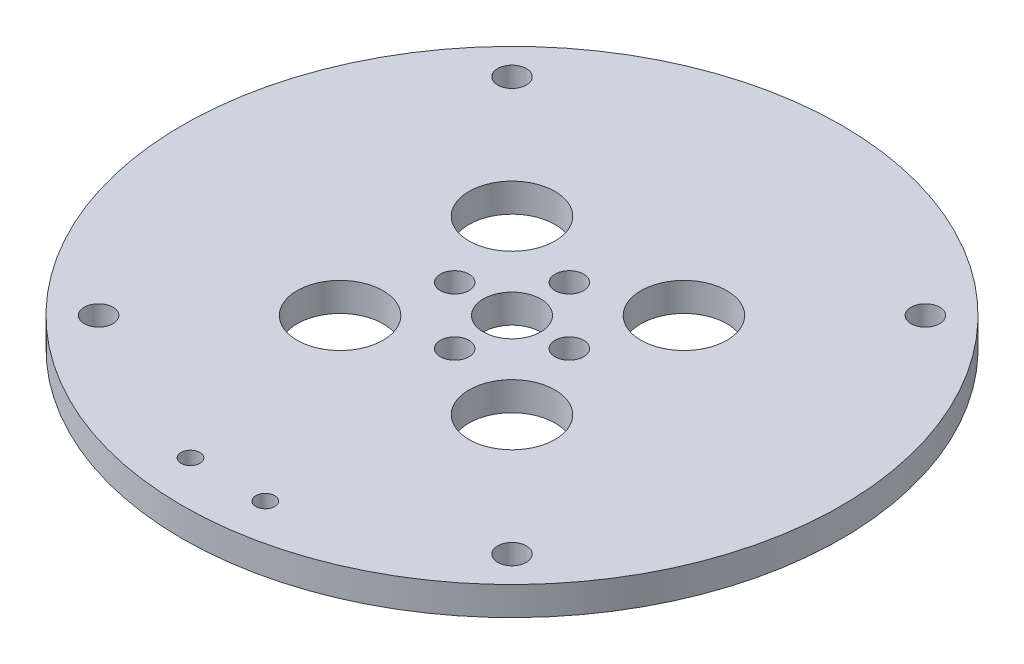
ISO-10303-21;
HEADER;
FILE_DESCRIPTION(('STEP AP214'),'2;1');
FILE_NAME('part.step','',(''),(''),'','','');
FILE_SCHEMA(('AUTOMOTIVE_DESIGN { 1 0 10303 214 1 1 1 1 }'));
ENDSEC;
DATA;
#1=APPLICATION_CONTEXT('core data for automotive mechanical design processes');
#2=APPLICATION_PROTOCOL_DEFINITION('international standard','automotive_design',2000,#1);
#3=PRODUCT_CONTEXT('',#1,'mechanical');
#4=PRODUCT('Part','Part','',(#3));
#5=PRODUCT_RELATED_PRODUCT_CATEGORY('part','',(#4));
#6=PRODUCT_DEFINITION_FORMATION('','',#4);
#7=PRODUCT_DEFINITION_CONTEXT('part definition',#1,'design');
#8=PRODUCT_DEFINITION('design','',#6,#7);
#9=PRODUCT_DEFINITION_SHAPE('','',#8);
#10=(LENGTH_UNIT() NAMED_UNIT(*) SI_UNIT(.MILLI.,.METRE.));
#11=(NAMED_UNIT(*) PLANE_ANGLE_UNIT() SI_UNIT($,.RADIAN.));
#12=(NAMED_UNIT(*) SI_UNIT($,.STERADIAN.) SOLID_ANGLE_UNIT());
#13=UNCERTAINTY_MEASURE_WITH_UNIT(LENGTH_MEASURE(1.E-05),#10,'distance_accuracy_value','');
#14=(GEOMETRIC_REPRESENTATION_CONTEXT(3) GLOBAL_UNCERTAINTY_ASSIGNED_CONTEXT((#13)) GLOBAL_UNIT_ASSIGNED_CONTEXT((#10,
#11,#12)) REPRESENTATION_CONTEXT('',''));
#15=CARTESIAN_POINT('',(0.,0.,0.));
#16=DIRECTION('',(0.,0.,1.));
#17=DIRECTION('',(1.,0.,0.));
#18=AXIS2_PLACEMENT_3D('',#15,#16,#17);
#19=CARTESIAN_POINT('',(0.,5.,0.));
#20=DIRECTION('',(0.,1.,0.));
#21=DIRECTION('',(0.,0.,1.));
#22=AXIS2_PLACEMENT_3D('',#19,#20,#21);
#23=PLANE('',#22);
#24=CARTESIAN_POINT('',(36.062445840514,5.,36.0624458405139));
#25=DIRECTION('',(0.,1.,0.));
#26=DIRECTION('',(0.,0.,1.));
#27=AXIS2_PLACEMENT_3D('',#24,#25,#26);
#28=CIRCLE('',#27,2.50000000000035);
#29=CARTESIAN_POINT('',(36.062445840514,5.,38.5624458405143));
#30=VERTEX_POINT('',#29);
#31=EDGE_CURVE('E119',#30,#30,#28,.T.);
#32=ORIENTED_EDGE('',*,*,#31,.F.);
#33=EDGE_LOOP('',(#32));
#34=FACE_BOUND('',#33,.T.);
#35=CARTESIAN_POINT('',(6.52630961100226,5.,49.5722430686906));
#36=DIRECTION('',(0.,1.,0.));
#37=DIRECTION('',(0.,0.,-1.));
#38=AXIS2_PLACEMENT_3D('',#35,#36,#37);
#39=CIRCLE('',#38,1.65);
#40=CARTESIAN_POINT('',(6.52630961100226,5.,47.9222430686906));
#41=VERTEX_POINT('',#40);
#42=EDGE_CURVE('E107',#41,#41,#39,.T.);
#43=ORIENTED_EDGE('',*,*,#42,.F.);
#44=EDGE_LOOP('',(#43));
#45=FACE_BOUND('',#44,.T.);
#46=CARTESIAN_POINT('',(-15.,5.,-15.));
#47=DIRECTION('',(0.,1.,0.));
#48=DIRECTION('',(0.,0.,-1.));
#49=AXIS2_PLACEMENT_3D('',#46,#47,#48);
#50=CIRCLE('',#49,7.5);
#51=CARTESIAN_POINT('',(-15.,5.,-22.5));
#52=VERTEX_POINT('',#51);
#53=EDGE_CURVE('E95',#52,#52,#50,.T.);
#54=ORIENTED_EDGE('',*,*,#53,.F.);
#55=EDGE_LOOP('',(#54));
#56=FACE_BOUND('',#55,.T.);
#57=CARTESIAN_POINT('',(15.,5.,15.));
#58=DIRECTION('',(0.,1.,0.));
#59=DIRECTION('',(0.,0.,-1.));
#60=AXIS2_PLACEMENT_3D('',#57,#58,#59);
#61=CIRCLE('',#60,7.5);
#62=CARTESIAN_POINT('',(15.,5.,7.5));
#63=VERTEX_POINT('',#62);
#64=EDGE_CURVE('E83',#63,#63,#61,.T.);
#65=ORIENTED_EDGE('',*,*,#64,.F.);
#66=EDGE_LOOP('',(#65));
#67=FACE_BOUND('',#66,.T.);
#68=CARTESIAN_POINT('',(0.,5.,-10.));
#69=DIRECTION('',(0.,1.,0.));
#70=DIRECTION('',(0.,0.,1.));
#71=AXIS2_PLACEMENT_3D('',#68,#69,#70);
#72=CIRCLE('',#71,2.5);
#73=CARTESIAN_POINT('',(0.,5.,-7.5));
#74=VERTEX_POINT('',#73);
#75=EDGE_CURVE('E71',#74,#74,#72,.T.);
#76=ORIENTED_EDGE('',*,*,#75,.F.);
#77=EDGE_LOOP('',(#76));
#78=FACE_BOUND('',#77,.T.);
#79=CARTESIAN_POINT('',(-10.,5.,0.));
#80=DIRECTION('',(0.,1.,0.));
#81=DIRECTION('',(0.,0.,1.));
#82=AXIS2_PLACEMENT_3D('',#79,#80,#81);
#83=CIRCLE('',#82,2.5);
#84=CARTESIAN_POINT('',(-10.,5.,2.5));
#85=VERTEX_POINT('',#84);
#86=EDGE_CURVE('E59',#85,#85,#83,.T.);
#87=ORIENTED_EDGE('',*,*,#86,.F.);
#88=EDGE_LOOP('',(#87));
#89=FACE_BOUND('',#88,.T.);
#90=CARTESIAN_POINT('',(10.,5.,0.));
#91=DIRECTION('',(0.,1.,0.));
#92=DIRECTION('',(0.,0.,1.));
#93=AXIS2_PLACEMENT_3D('',#90,#91,#92);
#94=CIRCLE('',#93,2.5);
#95=CARTESIAN_POINT('',(10.,5.,2.5));
#96=VERTEX_POINT('',#95);
#97=EDGE_CURVE('E47',#96,#96,#94,.T.);
#98=ORIENTED_EDGE('',*,*,#97,.F.);
#99=EDGE_LOOP('',(#98));
#100=FACE_BOUND('',#99,.T.);
#101=CARTESIAN_POINT('',(0.,5.,0.));
#102=DIRECTION('',(0.,1.,0.));
#103=DIRECTION('',(0.,0.,1.));
#104=AXIS2_PLACEMENT_3D('',#101,#102,#103);
#105=CIRCLE('',#104,57.5);
#106=CARTESIAN_POINT('',(0.,5.,57.5));
#107=VERTEX_POINT('',#106);
#108=EDGE_CURVE('E10',#107,#107,#105,.T.);
#109=ORIENTED_EDGE('',*,*,#108,.T.);
#110=EDGE_LOOP('',(#109));
#111=FACE_BOUND('',#110,.T.);
#112=CARTESIAN_POINT('',(-36.0624458405139,5.,-36.0624458405139));
#113=DIRECTION('',(0.,1.,0.));
#114=DIRECTION('',(0.,0.,1.));
#115=AXIS2_PLACEMENT_3D('',#112,#113,#114);
#116=CIRCLE('',#115,2.5);
#117=CARTESIAN_POINT('',(-36.0624458405139,5.,-33.5624458405139));
#118=VERTEX_POINT('',#117);
#119=EDGE_CURVE('E42',#118,#118,#116,.T.);
#120=ORIENTED_EDGE('',*,*,#119,.F.);
#121=EDGE_LOOP('',(#120));
#122=FACE_BOUND('',#121,.T.);
#123=CARTESIAN_POINT('',(0.,5.,10.));
#124=DIRECTION('',(0.,1.,0.));
#125=DIRECTION('',(0.,0.,1.));
#126=AXIS2_PLACEMENT_3D('',#123,#124,#125);
#127=CIRCLE('',#126,2.5);
#128=CARTESIAN_POINT('',(0.,5.,12.5));
#129=VERTEX_POINT('',#128);
#130=EDGE_CURVE('E53',#129,#129,#127,.T.);
#131=ORIENTED_EDGE('',*,*,#130,.F.);
#132=EDGE_LOOP('',(#131));
#133=FACE_BOUND('',#132,.T.);
#134=CARTESIAN_POINT('',(0.,5.,0.));
#135=DIRECTION('',(0.,1.,0.));
#136=DIRECTION('',(0.,0.,1.));
#137=AXIS2_PLACEMENT_3D('',#134,#135,#136);
#138=CIRCLE('',#137,5.);
#139=CARTESIAN_POINT('',(0.,5.,5.));
#140=VERTEX_POINT('',#139);
#141=EDGE_CURVE('E65',#140,#140,#138,.T.);
#142=ORIENTED_EDGE('',*,*,#141,.F.);
#143=EDGE_LOOP('',(#142));
#144=FACE_BOUND('',#143,.T.);
#145=CARTESIAN_POINT('',(15.,5.,-15.));
#146=DIRECTION('',(0.,1.,0.));
#147=DIRECTION('',(0.,0.,1.));
#148=AXIS2_PLACEMENT_3D('',#145,#146,#147);
#149=CIRCLE('',#148,7.5);
#150=CARTESIAN_POINT('',(15.,5.,-7.5));
#151=VERTEX_POINT('',#150);
#152=EDGE_CURVE('E77',#151,#151,#149,.T.);
#153=ORIENTED_EDGE('',*,*,#152,.F.);
#154=EDGE_LOOP('',(#153));
#155=FACE_BOUND('',#154,.T.);
#156=CARTESIAN_POINT('',(-15.,5.,15.));
#157=DIRECTION('',(0.,1.,0.));
#158=DIRECTION('',(0.,0.,1.));
#159=AXIS2_PLACEMENT_3D('',#156,#157,#158);
#160=CIRCLE('',#159,7.5);
#161=CARTESIAN_POINT('',(-15.,5.,22.5));
#162=VERTEX_POINT('',#161);
#163=EDGE_CURVE('E89',#162,#162,#160,.T.);
#164=ORIENTED_EDGE('',*,*,#163,.F.);
#165=EDGE_LOOP('',(#164));
#166=FACE_BOUND('',#165,.T.);
#167=CARTESIAN_POINT('',(-6.52630961100223,5.,49.5722430686906));
#168=DIRECTION('',(0.,1.,0.));
#169=DIRECTION('',(0.,0.,1.));
#170=AXIS2_PLACEMENT_3D('',#167,#168,#169);
#171=CIRCLE('',#170,1.65);
#172=CARTESIAN_POINT('',(-6.52630961100223,5.,51.2222430686906));
#173=VERTEX_POINT('',#172);
#174=EDGE_CURVE('E101',#173,#173,#171,.T.);
#175=ORIENTED_EDGE('',*,*,#174,.F.);
#176=EDGE_LOOP('',(#175));
#177=FACE_BOUND('',#176,.T.);
#178=CARTESIAN_POINT('',(36.0624458405139,5.,-36.0624458405139));
#179=DIRECTION('',(0.,1.,0.));
#180=DIRECTION('',(0.,0.,1.));
#181=AXIS2_PLACEMENT_3D('',#178,#179,#180);
#182=CIRCLE('',#181,2.50000000000018);
#183=CARTESIAN_POINT('',(36.0624458405139,5.,-33.5624458405138));
#184=VERTEX_POINT('',#183);
#185=EDGE_CURVE('E113',#184,#184,#182,.T.);
#186=ORIENTED_EDGE('',*,*,#185,.F.);
#187=EDGE_LOOP('',(#186));
#188=FACE_BOUND('',#187,.T.);
#189=CARTESIAN_POINT('',(-36.0624458405139,5.,36.0624458405139));
#190=DIRECTION('',(0.,1.,0.));
#191=DIRECTION('',(0.,0.,1.));
#192=AXIS2_PLACEMENT_3D('',#189,#190,#191);
#193=CIRCLE('',#192,2.50000000000049);
#194=CARTESIAN_POINT('',(-36.0624458405139,5.,38.5624458405144));
#195=VERTEX_POINT('',#194);
#196=EDGE_CURVE('E125',#195,#195,#193,.T.);
#197=ORIENTED_EDGE('',*,*,#196,.F.);
#198=EDGE_LOOP('',(#197));
#199=FACE_BOUND('',#198,.T.);
#200=ADVANCED_FACE('F31',(#34,#45,#56,#67,#78,#89,#100,#111,#122,#133,#144,#155,#166,#177,#188,
#199),#23,.T.);
#201=CARTESIAN_POINT('',(0.,0.,0.));
#202=DIRECTION('',(0.,1.,0.));
#203=DIRECTION('',(0.,0.,1.));
#204=AXIS2_PLACEMENT_3D('',#201,#202,#203);
#205=PLANE('',#204);
#206=CARTESIAN_POINT('',(0.,0.,0.));
#207=DIRECTION('',(0.,1.,0.));
#208=DIRECTION('',(0.,0.,1.));
#209=AXIS2_PLACEMENT_3D('',#206,#207,#208);
#210=CIRCLE('',#209,57.5);
#211=CARTESIAN_POINT('',(0.,0.,57.5));
#212=VERTEX_POINT('',#211);
#213=EDGE_CURVE('E35',#212,#212,#210,.T.);
#214=ORIENTED_EDGE('',*,*,#213,.F.);
#215=EDGE_LOOP('',(#214));
#216=FACE_BOUND('',#215,.T.);
#217=CARTESIAN_POINT('',(-36.0624458405139,0.,-36.0624458405139));
#218=DIRECTION('',(0.,1.,0.));
#219=DIRECTION('',(0.,0.,1.));
#220=AXIS2_PLACEMENT_3D('',#217,#218,#219);
#221=CIRCLE('',#220,2.5);
#222=CARTESIAN_POINT('',(-36.0624458405139,0.,-33.5624458405139));
#223=VERTEX_POINT('',#222);
#224=EDGE_CURVE('E44',#223,#223,#221,.T.);
#225=ORIENTED_EDGE('',*,*,#224,.T.);
#226=EDGE_LOOP('',(#225));
#227=FACE_BOUND('',#226,.T.);
#228=CARTESIAN_POINT('',(10.,0.,0.));
#229=DIRECTION('',(0.,1.,0.));
#230=DIRECTION('',(0.,0.,1.));
#231=AXIS2_PLACEMENT_3D('',#228,#229,#230);
#232=CIRCLE('',#231,2.5);
#233=CARTESIAN_POINT('',(10.,0.,2.5));
#234=VERTEX_POINT('',#233);
#235=EDGE_CURVE('E50',#234,#234,#232,.T.);
#236=ORIENTED_EDGE('',*,*,#235,.T.);
#237=EDGE_LOOP('',(#236));
#238=FACE_BOUND('',#237,.T.);
#239=CARTESIAN_POINT('',(0.,0.,10.));
#240=DIRECTION('',(0.,1.,0.));
#241=DIRECTION('',(0.,0.,1.));
#242=AXIS2_PLACEMENT_3D('',#239,#240,#241);
#243=CIRCLE('',#242,2.5);
#244=CARTESIAN_POINT('',(0.,0.,12.5));
#245=VERTEX_POINT('',#244);
#246=EDGE_CURVE('E56',#245,#245,#243,.T.);
#247=ORIENTED_EDGE('',*,*,#246,.T.);
#248=EDGE_LOOP('',(#247));
#249=FACE_BOUND('',#248,.T.);
#250=CARTESIAN_POINT('',(-10.,0.,0.));
#251=DIRECTION('',(0.,1.,0.));
#252=DIRECTION('',(0.,0.,1.));
#253=AXIS2_PLACEMENT_3D('',#250,#251,#252);
#254=CIRCLE('',#253,2.5);
#255=CARTESIAN_POINT('',(-10.,0.,2.5));
#256=VERTEX_POINT('',#255);
#257=EDGE_CURVE('E62',#256,#256,#254,.T.);
#258=ORIENTED_EDGE('',*,*,#257,.T.);
#259=EDGE_LOOP('',(#258));
#260=FACE_BOUND('',#259,.T.);
#261=CARTESIAN_POINT('',(0.,0.,0.));
#262=DIRECTION('',(0.,1.,0.));
#263=DIRECTION('',(0.,0.,1.));
#264=AXIS2_PLACEMENT_3D('',#261,#262,#263);
#265=CIRCLE('',#264,5.);
#266=CARTESIAN_POINT('',(0.,0.,5.));
#267=VERTEX_POINT('',#266);
#268=EDGE_CURVE('E68',#267,#267,#265,.T.);
#269=ORIENTED_EDGE('',*,*,#268,.T.);
#270=EDGE_LOOP('',(#269));
#271=FACE_BOUND('',#270,.T.);
#272=CARTESIAN_POINT('',(0.,0.,-10.));
#273=DIRECTION('',(0.,1.,0.));
#274=DIRECTION('',(0.,0.,1.));
#275=AXIS2_PLACEMENT_3D('',#272,#273,#274);
#276=CIRCLE('',#275,2.5);
#277=CARTESIAN_POINT('',(0.,0.,-7.5));
#278=VERTEX_POINT('',#277);
#279=EDGE_CURVE('E74',#278,#278,#276,.T.);
#280=ORIENTED_EDGE('',*,*,#279,.T.);
#281=EDGE_LOOP('',(#280));
#282=FACE_BOUND('',#281,.T.);
#283=CARTESIAN_POINT('',(15.,0.,-15.));
#284=DIRECTION('',(0.,1.,0.));
#285=DIRECTION('',(0.,0.,1.));
#286=AXIS2_PLACEMENT_3D('',#283,#284,#285);
#287=CIRCLE('',#286,7.5);
#288=CARTESIAN_POINT('',(15.,0.,-7.5));
#289=VERTEX_POINT('',#288);
#290=EDGE_CURVE('E80',#289,#289,#287,.T.);
#291=ORIENTED_EDGE('',*,*,#290,.T.);
#292=EDGE_LOOP('',(#291));
#293=FACE_BOUND('',#292,.T.);
#294=CARTESIAN_POINT('',(15.,0.,15.));
#295=DIRECTION('',(0.,1.,0.));
#296=DIRECTION('',(0.,0.,-1.));
#297=AXIS2_PLACEMENT_3D('',#294,#295,#296);
#298=CIRCLE('',#297,7.5);
#299=CARTESIAN_POINT('',(15.,0.,7.5));
#300=VERTEX_POINT('',#299);
#301=EDGE_CURVE('E86',#300,#300,#298,.T.);
#302=ORIENTED_EDGE('',*,*,#301,.T.);
#303=EDGE_LOOP('',(#302));
#304=FACE_BOUND('',#303,.T.);
#305=CARTESIAN_POINT('',(-15.,0.,15.));
#306=DIRECTION('',(0.,1.,0.));
#307=DIRECTION('',(0.,0.,1.));
#308=AXIS2_PLACEMENT_3D('',#305,#306,#307);
#309=CIRCLE('',#308,7.5);
#310=CARTESIAN_POINT('',(-15.,0.,22.5));
#311=VERTEX_POINT('',#310);
#312=EDGE_CURVE('E92',#311,#311,#309,.T.);
#313=ORIENTED_EDGE('',*,*,#312,.T.);
#314=EDGE_LOOP('',(#313));
#315=FACE_BOUND('',#314,.T.);
#316=CARTESIAN_POINT('',(-15.,0.,-15.));
#317=DIRECTION('',(0.,1.,0.));
#318=DIRECTION('',(0.,0.,-1.));
#319=AXIS2_PLACEMENT_3D('',#316,#317,#318);
#320=CIRCLE('',#319,7.5);
#321=CARTESIAN_POINT('',(-15.,0.,-22.5));
#322=VERTEX_POINT('',#321);
#323=EDGE_CURVE('E98',#322,#322,#320,.T.);
#324=ORIENTED_EDGE('',*,*,#323,.T.);
#325=EDGE_LOOP('',(#324));
#326=FACE_BOUND('',#325,.T.);
#327=CARTESIAN_POINT('',(-6.52630961100223,0.,49.5722430686906));
#328=DIRECTION('',(0.,1.,0.));
#329=DIRECTION('',(0.,0.,1.));
#330=AXIS2_PLACEMENT_3D('',#327,#328,#329);
#331=CIRCLE('',#330,1.65);
#332=CARTESIAN_POINT('',(-6.52630961100223,0.,51.2222430686906));
#333=VERTEX_POINT('',#332);
#334=EDGE_CURVE('E104',#333,#333,#331,.T.);
#335=ORIENTED_EDGE('',*,*,#334,.T.);
#336=EDGE_LOOP('',(#335));
#337=FACE_BOUND('',#336,.T.);
#338=CARTESIAN_POINT('',(6.52630961100226,0.,49.5722430686906));
#339=DIRECTION('',(0.,1.,0.));
#340=DIRECTION('',(0.,0.,-1.));
#341=AXIS2_PLACEMENT_3D('',#338,#339,#340);
#342=CIRCLE('',#341,1.65);
#343=CARTESIAN_POINT('',(6.52630961100226,0.,47.9222430686906));
#344=VERTEX_POINT('',#343);
#345=EDGE_CURVE('E110',#344,#344,#342,.T.);
#346=ORIENTED_EDGE('',*,*,#345,.T.);
#347=EDGE_LOOP('',(#346));
#348=FACE_BOUND('',#347,.T.);
#349=CARTESIAN_POINT('',(36.0624458405139,0.,-36.0624458405139));
#350=DIRECTION('',(0.,1.,0.));
#351=DIRECTION('',(0.,0.,1.));
#352=AXIS2_PLACEMENT_3D('',#349,#350,#351);
#353=CIRCLE('',#352,2.50000000000018);
#354=CARTESIAN_POINT('',(36.0624458405139,0.,-33.5624458405138));
#355=VERTEX_POINT('',#354);
#356=EDGE_CURVE('E116',#355,#355,#353,.T.);
#357=ORIENTED_EDGE('',*,*,#356,.T.);
#358=EDGE_LOOP('',(#357));
#359=FACE_BOUND('',#358,.T.);
#360=CARTESIAN_POINT('',(36.062445840514,0.,36.0624458405139));
#361=DIRECTION('',(0.,1.,0.));
#362=DIRECTION('',(0.,0.,1.));
#363=AXIS2_PLACEMENT_3D('',#360,#361,#362);
#364=CIRCLE('',#363,2.50000000000035);
#365=CARTESIAN_POINT('',(36.062445840514,0.,38.5624458405143));
#366=VERTEX_POINT('',#365);
#367=EDGE_CURVE('E122',#366,#366,#364,.T.);
#368=ORIENTED_EDGE('',*,*,#367,.T.);
#369=EDGE_LOOP('',(#368));
#370=FACE_BOUND('',#369,.T.);
#371=CARTESIAN_POINT('',(-36.0624458405139,0.,36.0624458405139));
#372=DIRECTION('',(0.,1.,0.));
#373=DIRECTION('',(0.,0.,1.));
#374=AXIS2_PLACEMENT_3D('',#371,#372,#373);
#375=CIRCLE('',#374,2.50000000000049);
#376=CARTESIAN_POINT('',(-36.0624458405139,0.,38.5624458405144));
#377=VERTEX_POINT('',#376);
#378=EDGE_CURVE('E128',#377,#377,#375,.T.);
#379=ORIENTED_EDGE('',*,*,#378,.T.);
#380=EDGE_LOOP('',(#379));
#381=FACE_BOUND('',#380,.T.);
#382=ADVANCED_FACE('F138',(#216,#227,#238,#249,#260,#271,#282,#293,#304,#315,#326,#337,#348,
#359,#370,#381),#205,.F.);
#383=CARTESIAN_POINT('',(0.,5.,0.));
#384=DIRECTION('',(0.,-1.,0.));
#385=DIRECTION('',(0.,0.,-1.));
#386=AXIS2_PLACEMENT_3D('',#383,#384,#385);
#387=CYLINDRICAL_SURFACE('',#386,57.5);
#388=ORIENTED_EDGE('',*,*,#108,.F.);
#389=EDGE_LOOP('',(#388));
#390=FACE_BOUND('',#389,.T.);
#391=ORIENTED_EDGE('',*,*,#213,.T.);
#392=EDGE_LOOP('',(#391));
#393=FACE_BOUND('',#392,.T.);
#394=ADVANCED_FACE('F33',(#390,#393),#387,.T.);
#395=CARTESIAN_POINT('',(-36.0624458405139,5.,-36.0624458405139));
#396=DIRECTION('',(0.,-1.,0.));
#397=DIRECTION('',(0.,0.,-1.));
#398=AXIS2_PLACEMENT_3D('',#395,#396,#397);
#399=CYLINDRICAL_SURFACE('',#398,2.5);
#400=ORIENTED_EDGE('',*,*,#119,.T.);
#401=EDGE_LOOP('',(#400));
#402=FACE_BOUND('',#401,.T.);
#403=ORIENTED_EDGE('',*,*,#224,.F.);
#404=EDGE_LOOP('',(#403));
#405=FACE_BOUND('',#404,.T.);
#406=ADVANCED_FACE('F148',(#402,#405),#399,.F.);
#407=CARTESIAN_POINT('',(10.,5.,0.));
#408=DIRECTION('',(0.,-1.,0.));
#409=DIRECTION('',(0.,0.,-1.));
#410=AXIS2_PLACEMENT_3D('',#407,#408,#409);
#411=CYLINDRICAL_SURFACE('',#410,2.5);
#412=ORIENTED_EDGE('',*,*,#97,.T.);
#413=EDGE_LOOP('',(#412));
#414=FACE_BOUND('',#413,.T.);
#415=ORIENTED_EDGE('',*,*,#235,.F.);
#416=EDGE_LOOP('',(#415));
#417=FACE_BOUND('',#416,.T.);
#418=ADVANCED_FACE('F151',(#414,#417),#411,.F.);
#419=CARTESIAN_POINT('',(0.,5.,10.));
#420=DIRECTION('',(0.,-1.,0.));
#421=DIRECTION('',(0.,0.,-1.));
#422=AXIS2_PLACEMENT_3D('',#419,#420,#421);
#423=CYLINDRICAL_SURFACE('',#422,2.5);
#424=ORIENTED_EDGE('',*,*,#130,.T.);
#425=EDGE_LOOP('',(#424));
#426=FACE_BOUND('',#425,.T.);
#427=ORIENTED_EDGE('',*,*,#246,.F.);
#428=EDGE_LOOP('',(#427));
#429=FACE_BOUND('',#428,.T.);
#430=ADVANCED_FACE('F155',(#426,#429),#423,.F.);
#431=CARTESIAN_POINT('',(-10.,5.,0.));
#432=DIRECTION('',(0.,-1.,0.));
#433=DIRECTION('',(0.,0.,-1.));
#434=AXIS2_PLACEMENT_3D('',#431,#432,#433);
#435=CYLINDRICAL_SURFACE('',#434,2.5);
#436=ORIENTED_EDGE('',*,*,#86,.T.);
#437=EDGE_LOOP('',(#436));
#438=FACE_BOUND('',#437,.T.);
#439=ORIENTED_EDGE('',*,*,#257,.F.);
#440=EDGE_LOOP('',(#439));
#441=FACE_BOUND('',#440,.T.);
#442=ADVANCED_FACE('F159',(#438,#441),#435,.F.);
#443=CARTESIAN_POINT('',(0.,5.,0.));
#444=DIRECTION('',(0.,-1.,0.));
#445=DIRECTION('',(0.,0.,-1.));
#446=AXIS2_PLACEMENT_3D('',#443,#444,#445);
#447=CYLINDRICAL_SURFACE('',#446,5.);
#448=ORIENTED_EDGE('',*,*,#141,.T.);
#449=EDGE_LOOP('',(#448));
#450=FACE_BOUND('',#449,.T.);
#451=ORIENTED_EDGE('',*,*,#268,.F.);
#452=EDGE_LOOP('',(#451));
#453=FACE_BOUND('',#452,.T.);
#454=ADVANCED_FACE('F163',(#450,#453),#447,.F.);
#455=CARTESIAN_POINT('',(0.,5.,-10.));
#456=DIRECTION('',(0.,-1.,0.));
#457=DIRECTION('',(0.,0.,-1.));
#458=AXIS2_PLACEMENT_3D('',#455,#456,#457);
#459=CYLINDRICAL_SURFACE('',#458,2.5);
#460=ORIENTED_EDGE('',*,*,#75,.T.);
#461=EDGE_LOOP('',(#460));
#462=FACE_BOUND('',#461,.T.);
#463=ORIENTED_EDGE('',*,*,#279,.F.);
#464=EDGE_LOOP('',(#463));
#465=FACE_BOUND('',#464,.T.);
#466=ADVANCED_FACE('F167',(#462,#465),#459,.F.);
#467=CARTESIAN_POINT('',(15.,5.,-15.));
#468=DIRECTION('',(0.,-1.,0.));
#469=DIRECTION('',(0.,0.,-1.));
#470=AXIS2_PLACEMENT_3D('',#467,#468,#469);
#471=CYLINDRICAL_SURFACE('',#470,7.5);
#472=ORIENTED_EDGE('',*,*,#152,.T.);
#473=EDGE_LOOP('',(#472));
#474=FACE_BOUND('',#473,.T.);
#475=ORIENTED_EDGE('',*,*,#290,.F.);
#476=EDGE_LOOP('',(#475));
#477=FACE_BOUND('',#476,.T.);
#478=ADVANCED_FACE('F171',(#474,#477),#471,.F.);
#479=CARTESIAN_POINT('',(15.,5.,15.));
#480=DIRECTION('',(0.,-1.,0.));
#481=DIRECTION('',(0.,0.,-1.));
#482=AXIS2_PLACEMENT_3D('',#479,#480,#481);
#483=CYLINDRICAL_SURFACE('',#482,7.5);
#484=ORIENTED_EDGE('',*,*,#64,.T.);
#485=EDGE_LOOP('',(#484));
#486=FACE_BOUND('',#485,.T.);
#487=ORIENTED_EDGE('',*,*,#301,.F.);
#488=EDGE_LOOP('',(#487));
#489=FACE_BOUND('',#488,.T.);
#490=ADVANCED_FACE('F175',(#486,#489),#483,.F.);
#491=CARTESIAN_POINT('',(-15.,5.,15.));
#492=DIRECTION('',(0.,-1.,0.));
#493=DIRECTION('',(0.,0.,-1.));
#494=AXIS2_PLACEMENT_3D('',#491,#492,#493);
#495=CYLINDRICAL_SURFACE('',#494,7.5);
#496=ORIENTED_EDGE('',*,*,#163,.T.);
#497=EDGE_LOOP('',(#496));
#498=FACE_BOUND('',#497,.T.);
#499=ORIENTED_EDGE('',*,*,#312,.F.);
#500=EDGE_LOOP('',(#499));
#501=FACE_BOUND('',#500,.T.);
#502=ADVANCED_FACE('F179',(#498,#501),#495,.F.);
#503=CARTESIAN_POINT('',(-15.,5.,-15.));
#504=DIRECTION('',(0.,-1.,0.));
#505=DIRECTION('',(0.,0.,-1.));
#506=AXIS2_PLACEMENT_3D('',#503,#504,#505);
#507=CYLINDRICAL_SURFACE('',#506,7.5);
#508=ORIENTED_EDGE('',*,*,#53,.T.);
#509=EDGE_LOOP('',(#508));
#510=FACE_BOUND('',#509,.T.);
#511=ORIENTED_EDGE('',*,*,#323,.F.);
#512=EDGE_LOOP('',(#511));
#513=FACE_BOUND('',#512,.T.);
#514=ADVANCED_FACE('F183',(#510,#513),#507,.F.);
#515=CARTESIAN_POINT('',(-6.52630961100223,5.,49.5722430686906));
#516=DIRECTION('',(0.,-1.,0.));
#517=DIRECTION('',(0.,0.,-1.));
#518=AXIS2_PLACEMENT_3D('',#515,#516,#517);
#519=CYLINDRICAL_SURFACE('',#518,1.65);
#520=ORIENTED_EDGE('',*,*,#174,.T.);
#521=EDGE_LOOP('',(#520));
#522=FACE_BOUND('',#521,.T.);
#523=ORIENTED_EDGE('',*,*,#334,.F.);
#524=EDGE_LOOP('',(#523));
#525=FACE_BOUND('',#524,.T.);
#526=ADVANCED_FACE('F187',(#522,#525),#519,.F.);
#527=CARTESIAN_POINT('',(6.52630961100226,5.,49.5722430686906));
#528=DIRECTION('',(0.,-1.,0.));
#529=DIRECTION('',(0.,0.,-1.));
#530=AXIS2_PLACEMENT_3D('',#527,#528,#529);
#531=CYLINDRICAL_SURFACE('',#530,1.65);
#532=ORIENTED_EDGE('',*,*,#42,.T.);
#533=EDGE_LOOP('',(#532));
#534=FACE_BOUND('',#533,.T.);
#535=ORIENTED_EDGE('',*,*,#345,.F.);
#536=EDGE_LOOP('',(#535));
#537=FACE_BOUND('',#536,.T.);
#538=ADVANCED_FACE('F191',(#534,#537),#531,.F.);
#539=CARTESIAN_POINT('',(36.0624458405139,5.,-36.0624458405139));
#540=DIRECTION('',(0.,-1.,0.));
#541=DIRECTION('',(0.,0.,-1.));
#542=AXIS2_PLACEMENT_3D('',#539,#540,#541);
#543=CYLINDRICAL_SURFACE('',#542,2.50000000000018);
#544=ORIENTED_EDGE('',*,*,#185,.T.);
#545=EDGE_LOOP('',(#544));
#546=FACE_BOUND('',#545,.T.);
#547=ORIENTED_EDGE('',*,*,#356,.F.);
#548=EDGE_LOOP('',(#547));
#549=FACE_BOUND('',#548,.T.);
#550=ADVANCED_FACE('F195',(#546,#549),#543,.F.);
#551=CARTESIAN_POINT('',(36.062445840514,5.,36.0624458405139));
#552=DIRECTION('',(0.,-1.,0.));
#553=DIRECTION('',(0.,0.,-1.));
#554=AXIS2_PLACEMENT_3D('',#551,#552,#553);
#555=CYLINDRICAL_SURFACE('',#554,2.50000000000035);
#556=ORIENTED_EDGE('',*,*,#31,.T.);
#557=EDGE_LOOP('',(#556));
#558=FACE_BOUND('',#557,.T.);
#559=ORIENTED_EDGE('',*,*,#367,.F.);
#560=EDGE_LOOP('',(#559));
#561=FACE_BOUND('',#560,.T.);
#562=ADVANCED_FACE('F199',(#558,#561),#555,.F.);
#563=CARTESIAN_POINT('',(-36.0624458405139,5.,36.0624458405139));
#564=DIRECTION('',(0.,-1.,0.));
#565=DIRECTION('',(0.,0.,-1.));
#566=AXIS2_PLACEMENT_3D('',#563,#564,#565);
#567=CYLINDRICAL_SURFACE('',#566,2.50000000000049);
#568=ORIENTED_EDGE('',*,*,#196,.T.);
#569=EDGE_LOOP('',(#568));
#570=FACE_BOUND('',#569,.T.);
#571=ORIENTED_EDGE('',*,*,#378,.F.);
#572=EDGE_LOOP('',(#571));
#573=FACE_BOUND('',#572,.T.);
#574=ADVANCED_FACE('F134',(#570,#573),#567,.F.);
#575=CLOSED_SHELL('',(#200,#382,#394,#406,#418,#430,#442,#454,#466,#478,#490,#502,#514,#526,
#538,#550,#562,#574));
#576=MANIFOLD_SOLID_BREP('B2',#575);
#577=ADVANCED_BREP_SHAPE_REPRESENTATION('',(#18,#576),#14);
#578=SHAPE_DEFINITION_REPRESENTATION(#9,#577);
ENDSEC;
END-ISO-10303-21;
